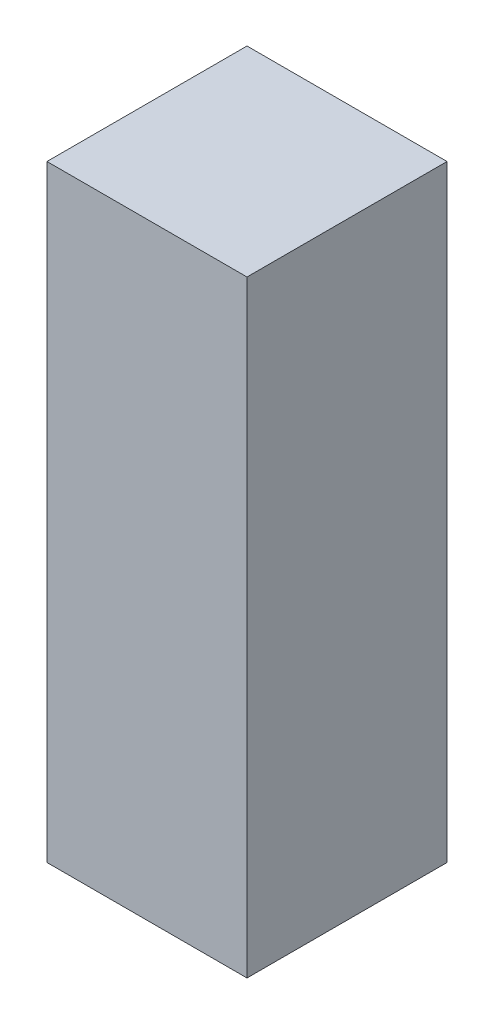
ISO-10303-21;
HEADER;
FILE_DESCRIPTION(('STEP AP214'),'2;1');
FILE_NAME('part.step','',(''),(''),'','','');
FILE_SCHEMA(('AUTOMOTIVE_DESIGN { 1 0 10303 214 1 1 1 1 }'));
ENDSEC;
DATA;
#1=APPLICATION_CONTEXT('core data for automotive mechanical design processes');
#2=APPLICATION_PROTOCOL_DEFINITION('international standard','automotive_design',2000,#1);
#3=PRODUCT_CONTEXT('',#1,'mechanical');
#4=PRODUCT('Part','Part','',(#3));
#5=PRODUCT_RELATED_PRODUCT_CATEGORY('part','',(#4));
#6=PRODUCT_DEFINITION_FORMATION('','',#4);
#7=PRODUCT_DEFINITION_CONTEXT('part definition',#1,'design');
#8=PRODUCT_DEFINITION('design','',#6,#7);
#9=PRODUCT_DEFINITION_SHAPE('','',#8);
#10=(LENGTH_UNIT() NAMED_UNIT(*) SI_UNIT(.MILLI.,.METRE.));
#11=(NAMED_UNIT(*) PLANE_ANGLE_UNIT() SI_UNIT($,.RADIAN.));
#12=(NAMED_UNIT(*) SI_UNIT($,.STERADIAN.) SOLID_ANGLE_UNIT());
#13=UNCERTAINTY_MEASURE_WITH_UNIT(LENGTH_MEASURE(1.E-05),#10,'distance_accuracy_value','');
#14=(GEOMETRIC_REPRESENTATION_CONTEXT(3) GLOBAL_UNCERTAINTY_ASSIGNED_CONTEXT((#13)) GLOBAL_UNIT_ASSIGNED_CONTEXT((#10,
#11,#12)) REPRESENTATION_CONTEXT('',''));
#15=CARTESIAN_POINT('',(0.,0.,0.));
#16=DIRECTION('',(0.,0.,1.));
#17=DIRECTION('',(1.,0.,0.));
#18=AXIS2_PLACEMENT_3D('',#15,#16,#17);
#19=CARTESIAN_POINT('',(50.,303.5,50.));
#20=DIRECTION('',(-1.,0.,0.));
#21=DIRECTION('',(0.,0.,1.));
#22=AXIS2_PLACEMENT_3D('',#19,#20,#21);
#23=PLANE('',#22);
#24=DIRECTION('',(0.,0.,-1.));
#25=VECTOR('',#24,1.);
#26=CARTESIAN_POINT('',(50.,0.,50.));
#27=LINE('',#26,#25);
#28=CARTESIAN_POINT('',(50.,0.,50.));
#29=VERTEX_POINT('',#28);
#30=CARTESIAN_POINT('',(50.,0.,-50.));
#31=VERTEX_POINT('',#30);
#32=EDGE_CURVE('E99',#29,#31,#27,.T.);
#33=ORIENTED_EDGE('',*,*,#32,.T.);
#34=DIRECTION('',(0.,-1.,0.));
#35=VECTOR('',#34,1.);
#36=CARTESIAN_POINT('',(50.,303.5,-50.));
#37=LINE('',#36,#35);
#38=CARTESIAN_POINT('',(50.,303.5,-50.));
#39=VERTEX_POINT('',#38);
#40=EDGE_CURVE('E11',#39,#31,#37,.T.);
#41=ORIENTED_EDGE('',*,*,#40,.F.);
#42=DIRECTION('',(0.,0.,-1.));
#43=VECTOR('',#42,1.);
#44=CARTESIAN_POINT('',(50.,303.5,50.));
#45=LINE('',#44,#43);
#46=CARTESIAN_POINT('',(50.,303.5,50.));
#47=VERTEX_POINT('',#46);
#48=EDGE_CURVE('E87',#47,#39,#45,.T.);
#49=ORIENTED_EDGE('',*,*,#48,.F.);
#50=DIRECTION('',(0.,-1.,0.));
#51=VECTOR('',#50,1.);
#52=CARTESIAN_POINT('',(50.,303.5,50.));
#53=LINE('',#52,#51);
#54=EDGE_CURVE('E95',#47,#29,#53,.T.);
#55=ORIENTED_EDGE('',*,*,#54,.T.);
#56=EDGE_LOOP('',(#33,#41,#49,#55));
#57=FACE_BOUND('',#56,.T.);
#58=ADVANCED_FACE('F36',(#57),#23,.F.);
#59=CARTESIAN_POINT('',(-50.,303.5,-50.));
#60=DIRECTION('',(0.,0.,1.));
#61=DIRECTION('',(1.,0.,0.));
#62=AXIS2_PLACEMENT_3D('',#59,#60,#61);
#63=PLANE('',#62);
#64=DIRECTION('',(-1.,0.,0.));
#65=VECTOR('',#64,1.);
#66=CARTESIAN_POINT('',(-50.,0.,-50.));
#67=LINE('',#66,#65);
#68=CARTESIAN_POINT('',(-50.,0.,-50.));
#69=VERTEX_POINT('',#68);
#70=EDGE_CURVE('E91',#31,#69,#67,.T.);
#71=ORIENTED_EDGE('',*,*,#70,.T.);
#72=DIRECTION('',(0.,-1.,0.));
#73=VECTOR('',#72,1.);
#74=CARTESIAN_POINT('',(-50.,303.5,-50.));
#75=LINE('',#74,#73);
#76=CARTESIAN_POINT('',(-50.,303.5,-50.));
#77=VERTEX_POINT('',#76);
#78=EDGE_CURVE('E44',#77,#69,#75,.T.);
#79=ORIENTED_EDGE('',*,*,#78,.F.);
#80=DIRECTION('',(-1.,0.,0.));
#81=VECTOR('',#80,1.);
#82=CARTESIAN_POINT('',(-50.,303.5,-50.));
#83=LINE('',#82,#81);
#84=EDGE_CURVE('E82',#39,#77,#83,.T.);
#85=ORIENTED_EDGE('',*,*,#84,.F.);
#86=ORIENTED_EDGE('',*,*,#40,.T.);
#87=EDGE_LOOP('',(#71,#79,#85,#86));
#88=FACE_BOUND('',#87,.T.);
#89=ADVANCED_FACE('F90',(#88),#63,.F.);
#90=CARTESIAN_POINT('',(-50.,303.5,50.));
#91=DIRECTION('',(1.,0.,0.));
#92=DIRECTION('',(0.,0.,-1.));
#93=AXIS2_PLACEMENT_3D('',#90,#91,#92);
#94=PLANE('',#93);
#95=DIRECTION('',(0.,0.,1.));
#96=VECTOR('',#95,1.);
#97=CARTESIAN_POINT('',(-50.,0.,50.));
#98=LINE('',#97,#96);
#99=CARTESIAN_POINT('',(-50.,0.,50.));
#100=VERTEX_POINT('',#99);
#101=EDGE_CURVE('E69',#69,#100,#98,.T.);
#102=ORIENTED_EDGE('',*,*,#101,.T.);
#103=DIRECTION('',(0.,-1.,0.));
#104=VECTOR('',#103,1.);
#105=CARTESIAN_POINT('',(-50.,303.5,50.));
#106=LINE('',#105,#104);
#107=CARTESIAN_POINT('',(-50.,303.5,50.));
#108=VERTEX_POINT('',#107);
#109=EDGE_CURVE('E92',#108,#100,#106,.T.);
#110=ORIENTED_EDGE('',*,*,#109,.F.);
#111=DIRECTION('',(0.,0.,1.));
#112=VECTOR('',#111,1.);
#113=CARTESIAN_POINT('',(-50.,303.5,50.));
#114=LINE('',#113,#112);
#115=EDGE_CURVE('E85',#77,#108,#114,.T.);
#116=ORIENTED_EDGE('',*,*,#115,.F.);
#117=ORIENTED_EDGE('',*,*,#78,.T.);
#118=EDGE_LOOP('',(#102,#110,#116,#117));
#119=FACE_BOUND('',#118,.T.);
#120=ADVANCED_FACE('F93',(#119),#94,.F.);
#121=CARTESIAN_POINT('',(-50.,303.5,50.));
#122=DIRECTION('',(0.,0.,-1.));
#123=DIRECTION('',(-1.,0.,0.));
#124=AXIS2_PLACEMENT_3D('',#121,#122,#123);
#125=PLANE('',#124);
#126=DIRECTION('',(1.,0.,0.));
#127=VECTOR('',#126,1.);
#128=CARTESIAN_POINT('',(-50.,0.,50.));
#129=LINE('',#128,#127);
#130=EDGE_CURVE('E75',#100,#29,#129,.T.);
#131=ORIENTED_EDGE('',*,*,#130,.T.);
#132=ORIENTED_EDGE('',*,*,#54,.F.);
#133=DIRECTION('',(1.,0.,0.));
#134=VECTOR('',#133,1.);
#135=CARTESIAN_POINT('',(-50.,303.5,50.));
#136=LINE('',#135,#134);
#137=EDGE_CURVE('E52',#108,#47,#136,.T.);
#138=ORIENTED_EDGE('',*,*,#137,.F.);
#139=ORIENTED_EDGE('',*,*,#109,.T.);
#140=EDGE_LOOP('',(#131,#132,#138,#139));
#141=FACE_BOUND('',#140,.T.);
#142=ADVANCED_FACE('F106',(#141),#125,.F.);
#143=CARTESIAN_POINT('',(0.,303.5,0.));
#144=DIRECTION('',(0.,-1.,0.));
#145=DIRECTION('',(0.,0.,-1.));
#146=AXIS2_PLACEMENT_3D('',#143,#144,#145);
#147=PLANE('',#146);
#148=ORIENTED_EDGE('',*,*,#48,.T.);
#149=ORIENTED_EDGE('',*,*,#84,.T.);
#150=ORIENTED_EDGE('',*,*,#115,.T.);
#151=ORIENTED_EDGE('',*,*,#137,.T.);
#152=EDGE_LOOP('',(#148,#149,#150,#151));
#153=FACE_BOUND('',#152,.T.);
#154=ADVANCED_FACE('F83',(#153),#147,.F.);
#155=CARTESIAN_POINT('',(0.,0.,0.));
#156=DIRECTION('',(0.,-1.,0.));
#157=DIRECTION('',(0.,0.,-1.));
#158=AXIS2_PLACEMENT_3D('',#155,#156,#157);
#159=PLANE('',#158);
#160=ORIENTED_EDGE('',*,*,#32,.F.);
#161=ORIENTED_EDGE('',*,*,#130,.F.);
#162=ORIENTED_EDGE('',*,*,#101,.F.);
#163=ORIENTED_EDGE('',*,*,#70,.F.);
#164=EDGE_LOOP('',(#160,#161,#162,#163));
#165=FACE_BOUND('',#164,.T.);
#166=ADVANCED_FACE('F109',(#165),#159,.T.);
#167=CLOSED_SHELL('',(#58,#89,#120,#142,#154,#166));
#168=MANIFOLD_SOLID_BREP('B2',#167);
#169=ADVANCED_BREP_SHAPE_REPRESENTATION('',(#18,#168),#14);
#170=SHAPE_DEFINITION_REPRESENTATION(#9,#169);
ENDSEC;
END-ISO-10303-21;
